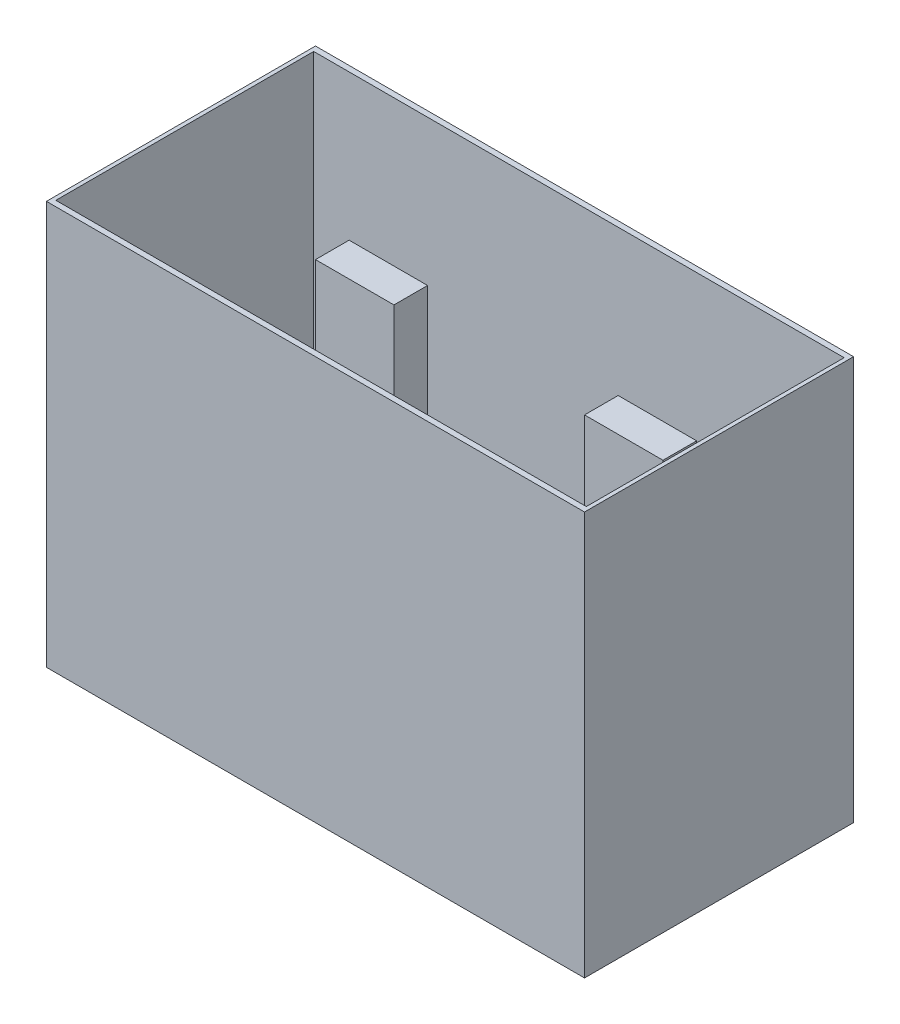
ISO-10303-21;
HEADER;
FILE_DESCRIPTION(('STEP AP214'),'2;1');
FILE_NAME('part.step','',(''),(''),'','','');
FILE_SCHEMA(('AUTOMOTIVE_DESIGN { 1 0 10303 214 1 1 1 1 }'));
ENDSEC;
DATA;
#1=APPLICATION_CONTEXT('core data for automotive mechanical design processes');
#2=APPLICATION_PROTOCOL_DEFINITION('international standard','automotive_design',2000,#1);
#3=PRODUCT_CONTEXT('',#1,'mechanical');
#4=PRODUCT('Part','Part','',(#3));
#5=PRODUCT_RELATED_PRODUCT_CATEGORY('part','',(#4));
#6=PRODUCT_DEFINITION_FORMATION('','',#4);
#7=PRODUCT_DEFINITION_CONTEXT('part definition',#1,'design');
#8=PRODUCT_DEFINITION('design','',#6,#7);
#9=PRODUCT_DEFINITION_SHAPE('','',#8);
#10=(LENGTH_UNIT() NAMED_UNIT(*) SI_UNIT(.MILLI.,.METRE.));
#11=(NAMED_UNIT(*) PLANE_ANGLE_UNIT() SI_UNIT($,.RADIAN.));
#12=(NAMED_UNIT(*) SI_UNIT($,.STERADIAN.) SOLID_ANGLE_UNIT());
#13=UNCERTAINTY_MEASURE_WITH_UNIT(LENGTH_MEASURE(1.E-05),#10,'distance_accuracy_value','');
#14=(GEOMETRIC_REPRESENTATION_CONTEXT(3) GLOBAL_UNCERTAINTY_ASSIGNED_CONTEXT((#13)) GLOBAL_UNIT_ASSIGNED_CONTEXT((#10,
#11,#12)) REPRESENTATION_CONTEXT('',''));
#15=CARTESIAN_POINT('',(0.,0.,0.));
#16=DIRECTION('',(0.,0.,1.));
#17=DIRECTION('',(1.,0.,0.));
#18=AXIS2_PLACEMENT_3D('',#15,#16,#17);
#19=CARTESIAN_POINT('',(0.,457.2,0.));
#20=DIRECTION('',(0.,-1.,0.));
#21=DIRECTION('',(0.,0.,-1.));
#22=AXIS2_PLACEMENT_3D('',#19,#20,#21);
#23=PLANE('',#22);
#24=DIRECTION('',(0.,0.,-1.));
#25=VECTOR('',#24,1.);
#26=CARTESIAN_POINT('',(304.8,457.2,152.4));
#27=LINE('',#26,#25);
#28=CARTESIAN_POINT('',(304.8,457.2,152.4));
#29=VERTEX_POINT('',#28);
#30=CARTESIAN_POINT('',(304.8,457.2,-152.4));
#31=VERTEX_POINT('',#30);
#32=EDGE_CURVE('E156',#29,#31,#27,.T.);
#33=ORIENTED_EDGE('',*,*,#32,.T.);
#34=DIRECTION('',(-1.,0.,0.));
#35=VECTOR('',#34,1.);
#36=CARTESIAN_POINT('',(-304.8,457.2,-152.4));
#37=LINE('',#36,#35);
#38=CARTESIAN_POINT('',(-304.8,457.2,-152.4));
#39=VERTEX_POINT('',#38);
#40=EDGE_CURVE('E159',#31,#39,#37,.T.);
#41=ORIENTED_EDGE('',*,*,#40,.T.);
#42=DIRECTION('',(0.,0.,1.));
#43=VECTOR('',#42,1.);
#44=CARTESIAN_POINT('',(-304.8,457.2,152.4));
#45=LINE('',#44,#43);
#46=CARTESIAN_POINT('',(-304.8,457.2,152.4));
#47=VERTEX_POINT('',#46);
#48=EDGE_CURVE('E162',#39,#47,#45,.T.);
#49=ORIENTED_EDGE('',*,*,#48,.T.);
#50=DIRECTION('',(1.,0.,0.));
#51=VECTOR('',#50,1.);
#52=CARTESIAN_POINT('',(-304.8,457.2,152.4));
#53=LINE('',#52,#51);
#54=EDGE_CURVE('E164',#47,#29,#53,.T.);
#55=ORIENTED_EDGE('',*,*,#54,.T.);
#56=EDGE_LOOP('',(#33,#41,#49,#55));
#57=FACE_BOUND('',#56,.T.);
#58=DIRECTION('',(0.,0.,-1.));
#59=VECTOR('',#58,1.);
#60=CARTESIAN_POINT('',(300.482,457.2,146.05));
#61=LINE('',#60,#59);
#62=CARTESIAN_POINT('',(300.482,457.2,146.05));
#63=VERTEX_POINT('',#62);
#64=CARTESIAN_POINT('',(300.482,457.2,-146.05));
#65=VERTEX_POINT('',#64);
#66=EDGE_CURVE('E120',#63,#65,#61,.T.);
#67=ORIENTED_EDGE('',*,*,#66,.F.);
#68=DIRECTION('',(1.,0.,0.));
#69=VECTOR('',#68,1.);
#70=CARTESIAN_POINT('',(-300.482,457.2,146.05));
#71=LINE('',#70,#69);
#72=CARTESIAN_POINT('',(-300.482,457.2,146.05));
#73=VERTEX_POINT('',#72);
#74=EDGE_CURVE('E142',#73,#63,#71,.T.);
#75=ORIENTED_EDGE('',*,*,#74,.F.);
#76=DIRECTION('',(0.,0.,1.));
#77=VECTOR('',#76,1.);
#78=CARTESIAN_POINT('',(-300.482,457.2,146.05));
#79=LINE('',#78,#77);
#80=CARTESIAN_POINT('',(-300.482,457.2,-146.05));
#81=VERTEX_POINT('',#80);
#82=EDGE_CURVE('E140',#81,#73,#79,.T.);
#83=ORIENTED_EDGE('',*,*,#82,.F.);
#84=DIRECTION('',(-1.,0.,0.));
#85=VECTOR('',#84,1.);
#86=CARTESIAN_POINT('',(-300.482,457.2,-146.05));
#87=LINE('',#86,#85);
#88=EDGE_CURVE('E128',#65,#81,#87,.T.);
#89=ORIENTED_EDGE('',*,*,#88,.F.);
#90=EDGE_LOOP('',(#67,#75,#83,#89));
#91=FACE_BOUND('',#90,.T.);
#92=ADVANCED_FACE('F55',(#57,#91),#23,.F.);
#93=CARTESIAN_POINT('',(0.,0.,0.));
#94=DIRECTION('',(0.,-1.,0.));
#95=DIRECTION('',(0.,0.,-1.));
#96=AXIS2_PLACEMENT_3D('',#93,#94,#95);
#97=PLANE('',#96);
#98=DIRECTION('',(0.,0.,-1.));
#99=VECTOR('',#98,1.);
#100=CARTESIAN_POINT('',(304.8,0.,152.4));
#101=LINE('',#100,#99);
#102=CARTESIAN_POINT('',(304.8,0.,152.4));
#103=VERTEX_POINT('',#102);
#104=CARTESIAN_POINT('',(304.8,0.,-152.4));
#105=VERTEX_POINT('',#104);
#106=EDGE_CURVE('E136',#103,#105,#101,.T.);
#107=ORIENTED_EDGE('',*,*,#106,.F.);
#108=DIRECTION('',(1.,0.,0.));
#109=VECTOR('',#108,1.);
#110=CARTESIAN_POINT('',(-304.8,0.,152.4));
#111=LINE('',#110,#109);
#112=CARTESIAN_POINT('',(-304.8,0.,152.4));
#113=VERTEX_POINT('',#112);
#114=EDGE_CURVE('E160',#113,#103,#111,.T.);
#115=ORIENTED_EDGE('',*,*,#114,.F.);
#116=DIRECTION('',(0.,0.,1.));
#117=VECTOR('',#116,1.);
#118=CARTESIAN_POINT('',(-304.8,0.,152.4));
#119=LINE('',#118,#117);
#120=CARTESIAN_POINT('',(-304.8,0.,-152.4));
#121=VERTEX_POINT('',#120);
#122=EDGE_CURVE('E171',#121,#113,#119,.T.);
#123=ORIENTED_EDGE('',*,*,#122,.F.);
#124=DIRECTION('',(-1.,0.,0.));
#125=VECTOR('',#124,1.);
#126=CARTESIAN_POINT('',(-304.8,0.,-152.4));
#127=LINE('',#126,#125);
#128=EDGE_CURVE('E169',#105,#121,#127,.T.);
#129=ORIENTED_EDGE('',*,*,#128,.F.);
#130=EDGE_LOOP('',(#107,#115,#123,#129));
#131=FACE_BOUND('',#130,.T.);
#132=DIRECTION('',(1.,0.,0.));
#133=VECTOR('',#132,1.);
#134=CARTESIAN_POINT('',(-300.482,0.,146.05));
#135=LINE('',#134,#133);
#136=CARTESIAN_POINT('',(-300.482,0.,146.05));
#137=VERTEX_POINT('',#136);
#138=CARTESIAN_POINT('',(300.482,0.,146.05));
#139=VERTEX_POINT('',#138);
#140=EDGE_CURVE('E129',#137,#139,#135,.T.);
#141=ORIENTED_EDGE('',*,*,#140,.T.);
#142=DIRECTION('',(0.,0.,-1.));
#143=VECTOR('',#142,1.);
#144=CARTESIAN_POINT('',(300.482,0.,146.05));
#145=LINE('',#144,#143);
#146=CARTESIAN_POINT('',(300.482,0.,-146.05));
#147=VERTEX_POINT('',#146);
#148=EDGE_CURVE('E78',#139,#147,#145,.T.);
#149=ORIENTED_EDGE('',*,*,#148,.T.);
#150=DIRECTION('',(-1.,0.,0.));
#151=VECTOR('',#150,1.);
#152=CARTESIAN_POINT('',(-300.482,0.,-146.05));
#153=LINE('',#152,#151);
#154=CARTESIAN_POINT('',(-300.482,0.,-146.05));
#155=VERTEX_POINT('',#154);
#156=EDGE_CURVE('E135',#147,#155,#153,.T.);
#157=ORIENTED_EDGE('',*,*,#156,.T.);
#158=DIRECTION('',(0.,0.,1.));
#159=VECTOR('',#158,1.);
#160=CARTESIAN_POINT('',(-300.482,0.,146.05));
#161=LINE('',#160,#159);
#162=EDGE_CURVE('E148',#155,#137,#161,.T.);
#163=ORIENTED_EDGE('',*,*,#162,.T.);
#164=EDGE_LOOP('',(#141,#149,#157,#163));
#165=FACE_BOUND('',#164,.T.);
#166=ADVANCED_FACE('F189',(#131,#165),#97,.T.);
#167=CARTESIAN_POINT('',(304.8,457.2,152.4));
#168=DIRECTION('',(-1.,0.,0.));
#169=DIRECTION('',(0.,0.,1.));
#170=AXIS2_PLACEMENT_3D('',#167,#168,#169);
#171=PLANE('',#170);
#172=ORIENTED_EDGE('',*,*,#106,.T.);
#173=DIRECTION('',(0.,-1.,0.));
#174=VECTOR('',#173,1.);
#175=CARTESIAN_POINT('',(304.8,457.2,-152.4));
#176=LINE('',#175,#174);
#177=EDGE_CURVE('E12',#31,#105,#176,.T.);
#178=ORIENTED_EDGE('',*,*,#177,.F.);
#179=ORIENTED_EDGE('',*,*,#32,.F.);
#180=DIRECTION('',(0.,-1.,0.));
#181=VECTOR('',#180,1.);
#182=CARTESIAN_POINT('',(304.8,457.2,152.4));
#183=LINE('',#182,#181);
#184=EDGE_CURVE('E166',#29,#103,#183,.T.);
#185=ORIENTED_EDGE('',*,*,#184,.T.);
#186=EDGE_LOOP('',(#172,#178,#179,#185));
#187=FACE_BOUND('',#186,.T.);
#188=ADVANCED_FACE('F57',(#187),#171,.F.);
#189=CARTESIAN_POINT('',(-304.8,457.2,-152.4));
#190=DIRECTION('',(0.,0.,1.));
#191=DIRECTION('',(1.,0.,0.));
#192=AXIS2_PLACEMENT_3D('',#189,#190,#191);
#193=PLANE('',#192);
#194=ORIENTED_EDGE('',*,*,#128,.T.);
#195=DIRECTION('',(0.,-1.,0.));
#196=VECTOR('',#195,1.);
#197=CARTESIAN_POINT('',(-304.8,457.2,-152.4));
#198=LINE('',#197,#196);
#199=EDGE_CURVE('E63',#39,#121,#198,.T.);
#200=ORIENTED_EDGE('',*,*,#199,.F.);
#201=ORIENTED_EDGE('',*,*,#40,.F.);
#202=ORIENTED_EDGE('',*,*,#177,.T.);
#203=EDGE_LOOP('',(#194,#200,#201,#202));
#204=FACE_BOUND('',#203,.T.);
#205=ADVANCED_FACE('F199',(#204),#193,.F.);
#206=CARTESIAN_POINT('',(-304.8,457.2,152.4));
#207=DIRECTION('',(1.,0.,0.));
#208=DIRECTION('',(0.,0.,-1.));
#209=AXIS2_PLACEMENT_3D('',#206,#207,#208);
#210=PLANE('',#209);
#211=ORIENTED_EDGE('',*,*,#122,.T.);
#212=DIRECTION('',(0.,-1.,0.));
#213=VECTOR('',#212,1.);
#214=CARTESIAN_POINT('',(-304.8,457.2,152.4));
#215=LINE('',#214,#213);
#216=EDGE_CURVE('E176',#47,#113,#215,.T.);
#217=ORIENTED_EDGE('',*,*,#216,.F.);
#218=ORIENTED_EDGE('',*,*,#48,.F.);
#219=ORIENTED_EDGE('',*,*,#199,.T.);
#220=EDGE_LOOP('',(#211,#217,#218,#219));
#221=FACE_BOUND('',#220,.T.);
#222=ADVANCED_FACE('F183',(#221),#210,.F.);
#223=CARTESIAN_POINT('',(-304.8,457.2,152.4));
#224=DIRECTION('',(0.,0.,-1.));
#225=DIRECTION('',(-1.,0.,0.));
#226=AXIS2_PLACEMENT_3D('',#223,#224,#225);
#227=PLANE('',#226);
#228=ORIENTED_EDGE('',*,*,#114,.T.);
#229=ORIENTED_EDGE('',*,*,#184,.F.);
#230=ORIENTED_EDGE('',*,*,#54,.F.);
#231=ORIENTED_EDGE('',*,*,#216,.T.);
#232=EDGE_LOOP('',(#228,#229,#230,#231));
#233=FACE_BOUND('',#232,.T.);
#234=ADVANCED_FACE('F193',(#233),#227,.F.);
#235=CARTESIAN_POINT('',(300.482,457.2,146.05));
#236=DIRECTION('',(-1.,0.,0.));
#237=DIRECTION('',(0.,0.,1.));
#238=AXIS2_PLACEMENT_3D('',#235,#236,#237);
#239=PLANE('',#238);
#240=ORIENTED_EDGE('',*,*,#148,.F.);
#241=DIRECTION('',(0.,-1.,0.));
#242=VECTOR('',#241,1.);
#243=CARTESIAN_POINT('',(300.482,457.2,146.05));
#244=LINE('',#243,#242);
#245=EDGE_CURVE('E124',#63,#139,#244,.T.);
#246=ORIENTED_EDGE('',*,*,#245,.F.);
#247=ORIENTED_EDGE('',*,*,#66,.T.);
#248=DIRECTION('',(0.,-1.,0.));
#249=VECTOR('',#248,1.);
#250=CARTESIAN_POINT('',(300.482,457.2,-146.05));
#251=LINE('',#250,#249);
#252=EDGE_CURVE('E123',#65,#147,#251,.T.);
#253=ORIENTED_EDGE('',*,*,#252,.T.);
#254=EDGE_LOOP('',(#240,#246,#247,#253));
#255=FACE_BOUND('',#254,.T.);
#256=ADVANCED_FACE('F122',(#255),#239,.T.);
#257=CARTESIAN_POINT('',(-300.482,457.2,-146.05));
#258=DIRECTION('',(0.,0.,1.));
#259=DIRECTION('',(1.,0.,0.));
#260=AXIS2_PLACEMENT_3D('',#257,#258,#259);
#261=PLANE('',#260);
#262=ORIENTED_EDGE('',*,*,#156,.F.);
#263=ORIENTED_EDGE('',*,*,#252,.F.);
#264=ORIENTED_EDGE('',*,*,#88,.T.);
#265=DIRECTION('',(0.,-1.,0.));
#266=VECTOR('',#265,1.);
#267=CARTESIAN_POINT('',(-300.482,457.2,-146.05));
#268=LINE('',#267,#266);
#269=EDGE_CURVE('E137',#81,#155,#268,.T.);
#270=ORIENTED_EDGE('',*,*,#269,.T.);
#271=EDGE_LOOP('',(#262,#263,#264,#270));
#272=FACE_BOUND('',#271,.T.);
#273=ADVANCED_FACE('F132',(#272),#261,.T.);
#274=CARTESIAN_POINT('',(-300.482,457.2,146.05));
#275=DIRECTION('',(1.,0.,0.));
#276=DIRECTION('',(0.,0.,-1.));
#277=AXIS2_PLACEMENT_3D('',#274,#275,#276);
#278=PLANE('',#277);
#279=ORIENTED_EDGE('',*,*,#162,.F.);
#280=ORIENTED_EDGE('',*,*,#269,.F.);
#281=ORIENTED_EDGE('',*,*,#82,.T.);
#282=DIRECTION('',(0.,-1.,0.));
#283=VECTOR('',#282,1.);
#284=CARTESIAN_POINT('',(-300.482,457.2,146.05));
#285=LINE('',#284,#283);
#286=EDGE_CURVE('E70',#73,#137,#285,.T.);
#287=ORIENTED_EDGE('',*,*,#286,.T.);
#288=EDGE_LOOP('',(#279,#280,#281,#287));
#289=FACE_BOUND('',#288,.T.);
#290=ADVANCED_FACE('F222',(#289),#278,.T.);
#291=CARTESIAN_POINT('',(-300.482,457.2,146.05));
#292=DIRECTION('',(0.,0.,-1.));
#293=DIRECTION('',(-1.,0.,0.));
#294=AXIS2_PLACEMENT_3D('',#291,#292,#293);
#295=PLANE('',#294);
#296=ORIENTED_EDGE('',*,*,#140,.F.);
#297=ORIENTED_EDGE('',*,*,#286,.F.);
#298=ORIENTED_EDGE('',*,*,#74,.T.);
#299=ORIENTED_EDGE('',*,*,#245,.T.);
#300=EDGE_LOOP('',(#296,#297,#298,#299));
#301=FACE_BOUND('',#300,.T.);
#302=ADVANCED_FACE('F226',(#301),#295,.T.);
#303=CLOSED_SHELL('',(#92,#166,#188,#205,#222,#234,#256,#273,#290,#302));
#304=MANIFOLD_SOLID_BREP('B2_NOT_SHOWN',#303);
#305=CARTESIAN_POINT('',(-292.1,6.35,-139.7));
#306=DIRECTION('',(1.,0.,0.));
#307=DIRECTION('',(0.,0.,-1.));
#308=AXIS2_PLACEMENT_3D('',#305,#306,#307);
#309=PLANE('',#308);
#310=DIRECTION('',(0.,0.,1.));
#311=VECTOR('',#310,1.);
#312=CARTESIAN_POINT('',(-292.1,0.,-139.7));
#313=LINE('',#312,#311);
#314=CARTESIAN_POINT('',(-292.1,0.,-139.7));
#315=VERTEX_POINT('',#314);
#316=CARTESIAN_POINT('',(-292.1,0.,139.7));
#317=VERTEX_POINT('',#316);
#318=EDGE_CURVE('E543',#315,#317,#313,.T.);
#319=ORIENTED_EDGE('',*,*,#318,.T.);
#320=DIRECTION('',(0.,-1.,0.));
#321=VECTOR('',#320,1.);
#322=CARTESIAN_POINT('',(-292.1,6.35,139.7));
#323=LINE('',#322,#321);
#324=CARTESIAN_POINT('',(-292.1,6.35,139.7));
#325=VERTEX_POINT('',#324);
#326=EDGE_CURVE('E53',#325,#317,#323,.T.);
#327=ORIENTED_EDGE('',*,*,#326,.F.);
#328=DIRECTION('',(0.,0.,1.));
#329=VECTOR('',#328,1.);
#330=CARTESIAN_POINT('',(-292.1,6.35,-139.7));
#331=LINE('',#330,#329);
#332=CARTESIAN_POINT('',(-292.1,6.35,-139.7));
#333=VERTEX_POINT('',#332);
#334=EDGE_CURVE('E549',#333,#325,#331,.T.);
#335=ORIENTED_EDGE('',*,*,#334,.F.);
#336=DIRECTION('',(0.,-1.,0.));
#337=VECTOR('',#336,1.);
#338=CARTESIAN_POINT('',(-292.1,6.35,-139.7));
#339=LINE('',#338,#337);
#340=EDGE_CURVE('E559',#333,#315,#339,.T.);
#341=ORIENTED_EDGE('',*,*,#340,.T.);
#342=EDGE_LOOP('',(#319,#327,#335,#341));
#343=FACE_BOUND('',#342,.T.);
#344=ADVANCED_FACE('F285',(#343),#309,.F.);
#345=CARTESIAN_POINT('',(-292.1,6.35,139.7));
#346=DIRECTION('',(0.,0.,-1.));
#347=DIRECTION('',(-1.,0.,0.));
#348=AXIS2_PLACEMENT_3D('',#345,#346,#347);
#349=PLANE('',#348);
#350=DIRECTION('',(1.,0.,0.));
#351=VECTOR('',#350,1.);
#352=CARTESIAN_POINT('',(-292.1,0.,139.7));
#353=LINE('',#352,#351);
#354=CARTESIAN_POINT('',(292.1,0.,139.7));
#355=VERTEX_POINT('',#354);
#356=EDGE_CURVE('E562',#317,#355,#353,.T.);
#357=ORIENTED_EDGE('',*,*,#356,.T.);
#358=DIRECTION('',(0.,-1.,0.));
#359=VECTOR('',#358,1.);
#360=CARTESIAN_POINT('',(292.1,6.35,139.7));
#361=LINE('',#360,#359);
#362=CARTESIAN_POINT('',(292.1,6.35,139.7));
#363=VERTEX_POINT('',#362);
#364=EDGE_CURVE('E292',#363,#355,#361,.T.);
#365=ORIENTED_EDGE('',*,*,#364,.F.);
#366=DIRECTION('',(1.,0.,0.));
#367=VECTOR('',#366,1.);
#368=CARTESIAN_POINT('',(-292.1,6.35,139.7));
#369=LINE('',#368,#367);
#370=EDGE_CURVE('E552',#325,#363,#369,.T.);
#371=ORIENTED_EDGE('',*,*,#370,.F.);
#372=ORIENTED_EDGE('',*,*,#326,.T.);
#373=EDGE_LOOP('',(#357,#365,#371,#372));
#374=FACE_BOUND('',#373,.T.);
#375=ADVANCED_FACE('F592',(#374),#349,.F.);
#376=CARTESIAN_POINT('',(292.1,6.35,-139.7));
#377=DIRECTION('',(-1.,0.,0.));
#378=DIRECTION('',(0.,0.,1.));
#379=AXIS2_PLACEMENT_3D('',#376,#377,#378);
#380=PLANE('',#379);
#381=DIRECTION('',(0.,0.,-1.));
#382=VECTOR('',#381,1.);
#383=CARTESIAN_POINT('',(292.1,0.,-139.7));
#384=LINE('',#383,#382);
#385=CARTESIAN_POINT('',(292.1,0.,-139.7));
#386=VERTEX_POINT('',#385);
#387=EDGE_CURVE('E564',#355,#386,#384,.T.);
#388=ORIENTED_EDGE('',*,*,#387,.T.);
#389=DIRECTION('',(0.,-1.,0.));
#390=VECTOR('',#389,1.);
#391=CARTESIAN_POINT('',(292.1,6.35,-139.7));
#392=LINE('',#391,#390);
#393=CARTESIAN_POINT('',(292.1,6.35,-139.7));
#394=VERTEX_POINT('',#393);
#395=EDGE_CURVE('E569',#394,#386,#392,.T.);
#396=ORIENTED_EDGE('',*,*,#395,.F.);
#397=DIRECTION('',(0.,0.,-1.));
#398=VECTOR('',#397,1.);
#399=CARTESIAN_POINT('',(292.1,6.35,-139.7));
#400=LINE('',#399,#398);
#401=EDGE_CURVE('E555',#363,#394,#400,.T.);
#402=ORIENTED_EDGE('',*,*,#401,.F.);
#403=ORIENTED_EDGE('',*,*,#364,.T.);
#404=EDGE_LOOP('',(#388,#396,#402,#403));
#405=FACE_BOUND('',#404,.T.);
#406=ADVANCED_FACE('F576',(#405),#380,.F.);
#407=CARTESIAN_POINT('',(-292.1,6.35,-139.7));
#408=DIRECTION('',(0.,0.,1.));
#409=DIRECTION('',(1.,0.,0.));
#410=AXIS2_PLACEMENT_3D('',#407,#408,#409);
#411=PLANE('',#410);
#412=DIRECTION('',(-1.,0.,0.));
#413=VECTOR('',#412,1.);
#414=CARTESIAN_POINT('',(-292.1,0.,-139.7));
#415=LINE('',#414,#413);
#416=EDGE_CURVE('E553',#386,#315,#415,.T.);
#417=ORIENTED_EDGE('',*,*,#416,.T.);
#418=ORIENTED_EDGE('',*,*,#340,.F.);
#419=DIRECTION('',(-1.,0.,0.));
#420=VECTOR('',#419,1.);
#421=CARTESIAN_POINT('',(-292.1,6.35,-139.7));
#422=LINE('',#421,#420);
#423=EDGE_CURVE('E557',#394,#333,#422,.T.);
#424=ORIENTED_EDGE('',*,*,#423,.F.);
#425=ORIENTED_EDGE('',*,*,#395,.T.);
#426=EDGE_LOOP('',(#417,#418,#424,#425));
#427=FACE_BOUND('',#426,.T.);
#428=ADVANCED_FACE('F585',(#427),#411,.F.);
#429=CARTESIAN_POINT('',(0.,6.35,0.));
#430=DIRECTION('',(0.,1.,0.));
#431=DIRECTION('',(0.,0.,1.));
#432=AXIS2_PLACEMENT_3D('',#429,#430,#431);
#433=PLANE('',#432);
#434=DIRECTION('',(1.,0.,0.));
#435=VECTOR('',#434,1.);
#436=CARTESIAN_POINT('',(63.5000000000001,6.35,-127.));
#437=LINE('',#436,#435);
#438=CARTESIAN_POINT('',(63.5000000000001,6.35,-127.));
#439=VERTEX_POINT('',#438);
#440=CARTESIAN_POINT('',(152.4,6.35,-127.));
#441=VERTEX_POINT('',#440);
#442=EDGE_CURVE('E453',#439,#441,#437,.T.);
#443=ORIENTED_EDGE('',*,*,#442,.T.);
#444=DIRECTION('',(0.,0.,-1.));
#445=VECTOR('',#444,1.);
#446=CARTESIAN_POINT('',(152.4,6.35,-88.9));
#447=LINE('',#446,#445);
#448=CARTESIAN_POINT('',(152.4,6.35,-88.9));
#449=VERTEX_POINT('',#448);
#450=EDGE_CURVE('E437',#449,#441,#447,.T.);
#451=ORIENTED_EDGE('',*,*,#450,.F.);
#452=DIRECTION('',(1.,0.,0.));
#453=VECTOR('',#452,1.);
#454=CARTESIAN_POINT('',(63.5000000000001,6.35,-88.9));
#455=LINE('',#454,#453);
#456=CARTESIAN_POINT('',(63.5000000000001,6.35,-88.9));
#457=VERTEX_POINT('',#456);
#458=EDGE_CURVE('E448',#457,#449,#455,.T.);
#459=ORIENTED_EDGE('',*,*,#458,.F.);
#460=DIRECTION('',(0.,0.,-1.));
#461=VECTOR('',#460,1.);
#462=CARTESIAN_POINT('',(63.5000000000001,6.35,-88.9));
#463=LINE('',#462,#461);
#464=EDGE_CURVE('E445',#457,#439,#463,.T.);
#465=ORIENTED_EDGE('',*,*,#464,.T.);
#466=EDGE_LOOP('',(#443,#451,#459,#465));
#467=FACE_BOUND('',#466,.T.);
#468=DIRECTION('',(1.,0.,0.));
#469=VECTOR('',#468,1.);
#470=CARTESIAN_POINT('',(-241.3,6.35,-127.));
#471=LINE('',#470,#469);
#472=CARTESIAN_POINT('',(-241.3,6.35,-127.));
#473=VERTEX_POINT('',#472);
#474=CARTESIAN_POINT('',(-152.4,6.35,-127.));
#475=VERTEX_POINT('',#474);
#476=EDGE_CURVE('E458',#473,#475,#471,.T.);
#477=ORIENTED_EDGE('',*,*,#476,.T.);
#478=DIRECTION('',(0.,0.,-1.));
#479=VECTOR('',#478,1.);
#480=CARTESIAN_POINT('',(-152.4,6.35,-88.9));
#481=LINE('',#480,#479);
#482=CARTESIAN_POINT('',(-152.4,6.35,-88.9));
#483=VERTEX_POINT('',#482);
#484=EDGE_CURVE('E476',#483,#475,#481,.T.);
#485=ORIENTED_EDGE('',*,*,#484,.F.);
#486=DIRECTION('',(1.,0.,0.));
#487=VECTOR('',#486,1.);
#488=CARTESIAN_POINT('',(-241.3,6.35,-88.9));
#489=LINE('',#488,#487);
#490=CARTESIAN_POINT('',(-241.3,6.35,-88.9));
#491=VERTEX_POINT('',#490);
#492=EDGE_CURVE('E478',#491,#483,#489,.T.);
#493=ORIENTED_EDGE('',*,*,#492,.F.);
#494=DIRECTION('',(0.,0.,-1.));
#495=VECTOR('',#494,1.);
#496=CARTESIAN_POINT('',(-241.3,6.35,-88.9));
#497=LINE('',#496,#495);
#498=EDGE_CURVE('E466',#491,#473,#497,.T.);
#499=ORIENTED_EDGE('',*,*,#498,.T.);
#500=EDGE_LOOP('',(#477,#485,#493,#499));
#501=FACE_BOUND('',#500,.T.);
#502=DIRECTION('',(1.,0.,0.));
#503=VECTOR('',#502,1.);
#504=CARTESIAN_POINT('',(63.5000000000001,6.35,88.9));
#505=LINE('',#504,#503);
#506=CARTESIAN_POINT('',(63.5000000000001,6.35,88.9));
#507=VERTEX_POINT('',#506);
#508=CARTESIAN_POINT('',(152.4,6.35,88.9));
#509=VERTEX_POINT('',#508);
#510=EDGE_CURVE('E484',#507,#509,#505,.T.);
#511=ORIENTED_EDGE('',*,*,#510,.T.);
#512=DIRECTION('',(0.,0.,-1.));
#513=VECTOR('',#512,1.);
#514=CARTESIAN_POINT('',(152.4,6.35,127.));
#515=LINE('',#514,#513);
#516=CARTESIAN_POINT('',(152.4,6.35,127.));
#517=VERTEX_POINT('',#516);
#518=EDGE_CURVE('E503',#517,#509,#515,.T.);
#519=ORIENTED_EDGE('',*,*,#518,.F.);
#520=DIRECTION('',(1.,0.,0.));
#521=VECTOR('',#520,1.);
#522=CARTESIAN_POINT('',(63.5000000000001,6.35,127.));
#523=LINE('',#522,#521);
#524=CARTESIAN_POINT('',(63.5000000000001,6.35,127.));
#525=VERTEX_POINT('',#524);
#526=EDGE_CURVE('E506',#525,#517,#523,.T.);
#527=ORIENTED_EDGE('',*,*,#526,.F.);
#528=DIRECTION('',(0.,0.,-1.));
#529=VECTOR('',#528,1.);
#530=CARTESIAN_POINT('',(63.5000000000001,6.35,127.));
#531=LINE('',#530,#529);
#532=EDGE_CURVE('E493',#525,#507,#531,.T.);
#533=ORIENTED_EDGE('',*,*,#532,.T.);
#534=EDGE_LOOP('',(#511,#519,#527,#533));
#535=FACE_BOUND('',#534,.T.);
#536=DIRECTION('',(1.,0.,0.));
#537=VECTOR('',#536,1.);
#538=CARTESIAN_POINT('',(-241.3,6.35,88.9));
#539=LINE('',#538,#537);
#540=CARTESIAN_POINT('',(-241.3,6.35,88.9));
#541=VERTEX_POINT('',#540);
#542=CARTESIAN_POINT('',(-152.4,6.35,88.9));
#543=VERTEX_POINT('',#542);
#544=EDGE_CURVE('E513',#541,#543,#539,.T.);
#545=ORIENTED_EDGE('',*,*,#544,.T.);
#546=DIRECTION('',(0.,0.,-1.));
#547=VECTOR('',#546,1.);
#548=CARTESIAN_POINT('',(-152.4,6.35,127.));
#549=LINE('',#548,#547);
#550=CARTESIAN_POINT('',(-152.4,6.35,127.));
#551=VERTEX_POINT('',#550);
#552=EDGE_CURVE('E533',#551,#543,#549,.T.);
#553=ORIENTED_EDGE('',*,*,#552,.F.);
#554=DIRECTION('',(1.,0.,0.));
#555=VECTOR('',#554,1.);
#556=CARTESIAN_POINT('',(-241.3,6.35,127.));
#557=LINE('',#556,#555);
#558=CARTESIAN_POINT('',(-241.3,6.35,127.));
#559=VERTEX_POINT('',#558);
#560=EDGE_CURVE('E536',#559,#551,#557,.T.);
#561=ORIENTED_EDGE('',*,*,#560,.F.);
#562=DIRECTION('',(0.,0.,-1.));
#563=VECTOR('',#562,1.);
#564=CARTESIAN_POINT('',(-241.3,6.35,127.));
#565=LINE('',#564,#563);
#566=EDGE_CURVE('E523',#559,#541,#565,.T.);
#567=ORIENTED_EDGE('',*,*,#566,.T.);
#568=EDGE_LOOP('',(#545,#553,#561,#567));
#569=FACE_BOUND('',#568,.T.);
#570=ORIENTED_EDGE('',*,*,#334,.T.);
#571=ORIENTED_EDGE('',*,*,#370,.T.);
#572=ORIENTED_EDGE('',*,*,#401,.T.);
#573=ORIENTED_EDGE('',*,*,#423,.T.);
#574=EDGE_LOOP('',(#570,#571,#572,#573));
#575=FACE_BOUND('',#574,.T.);
#576=ADVANCED_FACE('F591',(#467,#501,#535,#569,#575),#433,.T.);
#577=CARTESIAN_POINT('',(0.,0.,0.));
#578=DIRECTION('',(0.,1.,0.));
#579=DIRECTION('',(0.,0.,1.));
#580=AXIS2_PLACEMENT_3D('',#577,#578,#579);
#581=PLANE('',#580);
#582=ORIENTED_EDGE('',*,*,#318,.F.);
#583=ORIENTED_EDGE('',*,*,#416,.F.);
#584=ORIENTED_EDGE('',*,*,#387,.F.);
#585=ORIENTED_EDGE('',*,*,#356,.F.);
#586=EDGE_LOOP('',(#582,#583,#584,#585));
#587=FACE_BOUND('',#586,.T.);
#588=ADVANCED_FACE('F582',(#587),#581,.F.);
#589=CARTESIAN_POINT('',(-241.3,311.15,88.9));
#590=DIRECTION('',(0.,0.,-1.));
#591=DIRECTION('',(-1.,0.,0.));
#592=AXIS2_PLACEMENT_3D('',#589,#590,#591);
#593=PLANE('',#592);
#594=ORIENTED_EDGE('',*,*,#544,.F.);
#595=DIRECTION('',(0.,-1.,0.));
#596=VECTOR('',#595,1.);
#597=CARTESIAN_POINT('',(-241.3,311.15,88.9));
#598=LINE('',#597,#596);
#599=CARTESIAN_POINT('',(-241.3,311.15,88.9));
#600=VERTEX_POINT('',#599);
#601=EDGE_CURVE('E541',#600,#541,#598,.T.);
#602=ORIENTED_EDGE('',*,*,#601,.F.);
#603=DIRECTION('',(1.,0.,0.));
#604=VECTOR('',#603,1.);
#605=CARTESIAN_POINT('',(-241.3,311.15,88.9));
#606=LINE('',#605,#604);
#607=CARTESIAN_POINT('',(-152.4,311.15,88.9));
#608=VERTEX_POINT('',#607);
#609=EDGE_CURVE('E519',#600,#608,#606,.T.);
#610=ORIENTED_EDGE('',*,*,#609,.T.);
#611=DIRECTION('',(0.,-1.,0.));
#612=VECTOR('',#611,1.);
#613=CARTESIAN_POINT('',(-152.4,311.15,88.9));
#614=LINE('',#613,#612);
#615=EDGE_CURVE('E530',#608,#543,#614,.T.);
#616=ORIENTED_EDGE('',*,*,#615,.T.);
#617=EDGE_LOOP('',(#594,#602,#610,#616));
#618=FACE_BOUND('',#617,.T.);
#619=ADVANCED_FACE('F604',(#618),#593,.T.);
#620=CARTESIAN_POINT('',(-241.3,311.15,127.));
#621=DIRECTION('',(-1.,0.,0.));
#622=DIRECTION('',(0.,0.,1.));
#623=AXIS2_PLACEMENT_3D('',#620,#621,#622);
#624=PLANE('',#623);
#625=ORIENTED_EDGE('',*,*,#566,.F.);
#626=DIRECTION('',(0.,-1.,0.));
#627=VECTOR('',#626,1.);
#628=CARTESIAN_POINT('',(-241.3,311.15,127.));
#629=LINE('',#628,#627);
#630=CARTESIAN_POINT('',(-241.3,311.15,127.));
#631=VERTEX_POINT('',#630);
#632=EDGE_CURVE('E544',#631,#559,#629,.T.);
#633=ORIENTED_EDGE('',*,*,#632,.F.);
#634=DIRECTION('',(0.,0.,-1.));
#635=VECTOR('',#634,1.);
#636=CARTESIAN_POINT('',(-241.3,311.15,127.));
#637=LINE('',#636,#635);
#638=EDGE_CURVE('E527',#631,#600,#637,.T.);
#639=ORIENTED_EDGE('',*,*,#638,.T.);
#640=ORIENTED_EDGE('',*,*,#601,.T.);
#641=EDGE_LOOP('',(#625,#633,#639,#640));
#642=FACE_BOUND('',#641,.T.);
#643=ADVANCED_FACE('F610',(#642),#624,.T.);
#644=CARTESIAN_POINT('',(-241.3,311.15,127.));
#645=DIRECTION('',(0.,0.,-1.));
#646=DIRECTION('',(-1.,0.,0.));
#647=AXIS2_PLACEMENT_3D('',#644,#645,#646);
#648=PLANE('',#647);
#649=ORIENTED_EDGE('',*,*,#560,.T.);
#650=DIRECTION('',(0.,-1.,0.));
#651=VECTOR('',#650,1.);
#652=CARTESIAN_POINT('',(-152.4,311.15,127.));
#653=LINE('',#652,#651);
#654=CARTESIAN_POINT('',(-152.4,311.15,127.));
#655=VERTEX_POINT('',#654);
#656=EDGE_CURVE('E546',#655,#551,#653,.T.);
#657=ORIENTED_EDGE('',*,*,#656,.F.);
#658=DIRECTION('',(1.,0.,0.));
#659=VECTOR('',#658,1.);
#660=CARTESIAN_POINT('',(-241.3,311.15,127.));
#661=LINE('',#660,#659);
#662=EDGE_CURVE('E525',#631,#655,#661,.T.);
#663=ORIENTED_EDGE('',*,*,#662,.F.);
#664=ORIENTED_EDGE('',*,*,#632,.T.);
#665=EDGE_LOOP('',(#649,#657,#663,#664));
#666=FACE_BOUND('',#665,.T.);
#667=ADVANCED_FACE('F616',(#666),#648,.F.);
#668=CARTESIAN_POINT('',(-152.4,311.15,127.));
#669=DIRECTION('',(-1.,0.,0.));
#670=DIRECTION('',(0.,0.,1.));
#671=AXIS2_PLACEMENT_3D('',#668,#669,#670);
#672=PLANE('',#671);
#673=ORIENTED_EDGE('',*,*,#552,.T.);
#674=ORIENTED_EDGE('',*,*,#615,.F.);
#675=DIRECTION('',(0.,0.,-1.));
#676=VECTOR('',#675,1.);
#677=CARTESIAN_POINT('',(-152.4,311.15,127.));
#678=LINE('',#677,#676);
#679=EDGE_CURVE('E522',#655,#608,#678,.T.);
#680=ORIENTED_EDGE('',*,*,#679,.F.);
#681=ORIENTED_EDGE('',*,*,#656,.T.);
#682=EDGE_LOOP('',(#673,#674,#680,#681));
#683=FACE_BOUND('',#682,.T.);
#684=ADVANCED_FACE('F612',(#683),#672,.F.);
#685=CARTESIAN_POINT('',(0.,311.15,0.));
#686=DIRECTION('',(0.,1.,0.));
#687=DIRECTION('',(0.,0.,1.));
#688=AXIS2_PLACEMENT_3D('',#685,#686,#687);
#689=PLANE('',#688);
#690=ORIENTED_EDGE('',*,*,#609,.F.);
#691=ORIENTED_EDGE('',*,*,#638,.F.);
#692=ORIENTED_EDGE('',*,*,#662,.T.);
#693=ORIENTED_EDGE('',*,*,#679,.T.);
#694=EDGE_LOOP('',(#690,#691,#692,#693));
#695=FACE_BOUND('',#694,.T.);
#696=ADVANCED_FACE('F615',(#695),#689,.T.);
#697=CARTESIAN_POINT('',(63.5000000000001,311.15,88.9));
#698=DIRECTION('',(0.,0.,-1.));
#699=DIRECTION('',(-1.,0.,0.));
#700=AXIS2_PLACEMENT_3D('',#697,#698,#699);
#701=PLANE('',#700);
#702=ORIENTED_EDGE('',*,*,#510,.F.);
#703=DIRECTION('',(0.,-1.,0.));
#704=VECTOR('',#703,1.);
#705=CARTESIAN_POINT('',(63.5000000000001,311.15,88.9));
#706=LINE('',#705,#704);
#707=CARTESIAN_POINT('',(63.5000000000001,311.15,88.9));
#708=VERTEX_POINT('',#707);
#709=EDGE_CURVE('E511',#708,#507,#706,.T.);
#710=ORIENTED_EDGE('',*,*,#709,.F.);
#711=DIRECTION('',(1.,0.,0.));
#712=VECTOR('',#711,1.);
#713=CARTESIAN_POINT('',(63.5000000000001,311.15,88.9));
#714=LINE('',#713,#712);
#715=CARTESIAN_POINT('',(152.4,311.15,88.9));
#716=VERTEX_POINT('',#715);
#717=EDGE_CURVE('E489',#708,#716,#714,.T.);
#718=ORIENTED_EDGE('',*,*,#717,.T.);
#719=DIRECTION('',(0.,-1.,0.));
#720=VECTOR('',#719,1.);
#721=CARTESIAN_POINT('',(152.4,311.15,88.9));
#722=LINE('',#721,#720);
#723=EDGE_CURVE('E500',#716,#509,#722,.T.);
#724=ORIENTED_EDGE('',*,*,#723,.T.);
#725=EDGE_LOOP('',(#702,#710,#718,#724));
#726=FACE_BOUND('',#725,.T.);
#727=ADVANCED_FACE('F626',(#726),#701,.T.);
#728=CARTESIAN_POINT('',(63.5000000000001,311.15,127.));
#729=DIRECTION('',(-1.,0.,0.));
#730=DIRECTION('',(0.,0.,1.));
#731=AXIS2_PLACEMENT_3D('',#728,#729,#730);
#732=PLANE('',#731);
#733=ORIENTED_EDGE('',*,*,#532,.F.);
#734=DIRECTION('',(0.,-1.,0.));
#735=VECTOR('',#734,1.);
#736=CARTESIAN_POINT('',(63.5000000000001,311.15,127.));
#737=LINE('',#736,#735);
#738=CARTESIAN_POINT('',(63.5000000000001,311.15,127.));
#739=VERTEX_POINT('',#738);
#740=EDGE_CURVE('E514',#739,#525,#737,.T.);
#741=ORIENTED_EDGE('',*,*,#740,.F.);
#742=DIRECTION('',(0.,0.,-1.));
#743=VECTOR('',#742,1.);
#744=CARTESIAN_POINT('',(63.5000000000001,311.15,127.));
#745=LINE('',#744,#743);
#746=EDGE_CURVE('E497',#739,#708,#745,.T.);
#747=ORIENTED_EDGE('',*,*,#746,.T.);
#748=ORIENTED_EDGE('',*,*,#709,.T.);
#749=EDGE_LOOP('',(#733,#741,#747,#748));
#750=FACE_BOUND('',#749,.T.);
#751=ADVANCED_FACE('F630',(#750),#732,.T.);
#752=CARTESIAN_POINT('',(63.5000000000001,311.15,127.));
#753=DIRECTION('',(0.,0.,-1.));
#754=DIRECTION('',(-1.,0.,0.));
#755=AXIS2_PLACEMENT_3D('',#752,#753,#754);
#756=PLANE('',#755);
#757=ORIENTED_EDGE('',*,*,#526,.T.);
#758=DIRECTION('',(0.,-1.,0.));
#759=VECTOR('',#758,1.);
#760=CARTESIAN_POINT('',(152.4,311.15,127.));
#761=LINE('',#760,#759);
#762=CARTESIAN_POINT('',(152.4,311.15,127.));
#763=VERTEX_POINT('',#762);
#764=EDGE_CURVE('E516',#763,#517,#761,.T.);
#765=ORIENTED_EDGE('',*,*,#764,.F.);
#766=DIRECTION('',(1.,0.,0.));
#767=VECTOR('',#766,1.);
#768=CARTESIAN_POINT('',(63.5000000000001,311.15,127.));
#769=LINE('',#768,#767);
#770=EDGE_CURVE('E495',#739,#763,#769,.T.);
#771=ORIENTED_EDGE('',*,*,#770,.F.);
#772=ORIENTED_EDGE('',*,*,#740,.T.);
#773=EDGE_LOOP('',(#757,#765,#771,#772));
#774=FACE_BOUND('',#773,.T.);
#775=ADVANCED_FACE('F636',(#774),#756,.F.);
#776=CARTESIAN_POINT('',(152.4,311.15,127.));
#777=DIRECTION('',(-1.,0.,0.));
#778=DIRECTION('',(0.,0.,1.));
#779=AXIS2_PLACEMENT_3D('',#776,#777,#778);
#780=PLANE('',#779);
#781=ORIENTED_EDGE('',*,*,#518,.T.);
#782=ORIENTED_EDGE('',*,*,#723,.F.);
#783=DIRECTION('',(0.,0.,-1.));
#784=VECTOR('',#783,1.);
#785=CARTESIAN_POINT('',(152.4,311.15,127.));
#786=LINE('',#785,#784);
#787=EDGE_CURVE('E492',#763,#716,#786,.T.);
#788=ORIENTED_EDGE('',*,*,#787,.F.);
#789=ORIENTED_EDGE('',*,*,#764,.T.);
#790=EDGE_LOOP('',(#781,#782,#788,#789));
#791=FACE_BOUND('',#790,.T.);
#792=ADVANCED_FACE('F632',(#791),#780,.F.);
#793=CARTESIAN_POINT('',(304.8,311.15,0.));
#794=DIRECTION('',(0.,1.,0.));
#795=DIRECTION('',(0.,0.,1.));
#796=AXIS2_PLACEMENT_3D('',#793,#794,#795);
#797=PLANE('',#796);
#798=ORIENTED_EDGE('',*,*,#717,.F.);
#799=ORIENTED_EDGE('',*,*,#746,.F.);
#800=ORIENTED_EDGE('',*,*,#770,.T.);
#801=ORIENTED_EDGE('',*,*,#787,.T.);
#802=EDGE_LOOP('',(#798,#799,#800,#801));
#803=FACE_BOUND('',#802,.T.);
#804=ADVANCED_FACE('F635',(#803),#797,.T.);
#805=CARTESIAN_POINT('',(-241.3,311.15,-127.));
#806=DIRECTION('',(0.,0.,-1.));
#807=DIRECTION('',(-1.,0.,0.));
#808=AXIS2_PLACEMENT_3D('',#805,#806,#807);
#809=PLANE('',#808);
#810=ORIENTED_EDGE('',*,*,#476,.F.);
#811=DIRECTION('',(0.,-1.,0.));
#812=VECTOR('',#811,1.);
#813=CARTESIAN_POINT('',(-241.3,311.15,-127.));
#814=LINE('',#813,#812);
#815=CARTESIAN_POINT('',(-241.3,311.15,-127.));
#816=VERTEX_POINT('',#815);
#817=EDGE_CURVE('E482',#816,#473,#814,.T.);
#818=ORIENTED_EDGE('',*,*,#817,.F.);
#819=DIRECTION('',(1.,0.,0.));
#820=VECTOR('',#819,1.);
#821=CARTESIAN_POINT('',(-241.3,311.15,-127.));
#822=LINE('',#821,#820);
#823=CARTESIAN_POINT('',(-152.4,311.15,-127.));
#824=VERTEX_POINT('',#823);
#825=EDGE_CURVE('E462',#816,#824,#822,.T.);
#826=ORIENTED_EDGE('',*,*,#825,.T.);
#827=DIRECTION('',(0.,-1.,0.));
#828=VECTOR('',#827,1.);
#829=CARTESIAN_POINT('',(-152.4,311.15,-127.));
#830=LINE('',#829,#828);
#831=EDGE_CURVE('E473',#824,#475,#830,.T.);
#832=ORIENTED_EDGE('',*,*,#831,.T.);
#833=EDGE_LOOP('',(#810,#818,#826,#832));
#834=FACE_BOUND('',#833,.T.);
#835=ADVANCED_FACE('F646',(#834),#809,.T.);
#836=CARTESIAN_POINT('',(-241.3,311.15,-88.9));
#837=DIRECTION('',(-1.,0.,0.));
#838=DIRECTION('',(0.,0.,1.));
#839=AXIS2_PLACEMENT_3D('',#836,#837,#838);
#840=PLANE('',#839);
#841=ORIENTED_EDGE('',*,*,#498,.F.);
#842=DIRECTION('',(0.,-1.,0.));
#843=VECTOR('',#842,1.);
#844=CARTESIAN_POINT('',(-241.3,311.15,-88.9));
#845=LINE('',#844,#843);
#846=CARTESIAN_POINT('',(-241.3,311.15,-88.9));
#847=VERTEX_POINT('',#846);
#848=EDGE_CURVE('E485',#847,#491,#845,.T.);
#849=ORIENTED_EDGE('',*,*,#848,.F.);
#850=DIRECTION('',(0.,0.,-1.));
#851=VECTOR('',#850,1.);
#852=CARTESIAN_POINT('',(-241.3,311.15,-88.9));
#853=LINE('',#852,#851);
#854=EDGE_CURVE('E470',#847,#816,#853,.T.);
#855=ORIENTED_EDGE('',*,*,#854,.T.);
#856=ORIENTED_EDGE('',*,*,#817,.T.);
#857=EDGE_LOOP('',(#841,#849,#855,#856));
#858=FACE_BOUND('',#857,.T.);
#859=ADVANCED_FACE('F650',(#858),#840,.T.);
#860=CARTESIAN_POINT('',(-241.3,311.15,-88.9));
#861=DIRECTION('',(0.,0.,-1.));
#862=DIRECTION('',(-1.,0.,0.));
#863=AXIS2_PLACEMENT_3D('',#860,#861,#862);
#864=PLANE('',#863);
#865=ORIENTED_EDGE('',*,*,#492,.T.);
#866=DIRECTION('',(0.,-1.,0.));
#867=VECTOR('',#866,1.);
#868=CARTESIAN_POINT('',(-152.4,311.15,-88.9));
#869=LINE('',#868,#867);
#870=CARTESIAN_POINT('',(-152.4,311.15,-88.9));
#871=VERTEX_POINT('',#870);
#872=EDGE_CURVE('E307',#871,#483,#869,.T.);
#873=ORIENTED_EDGE('',*,*,#872,.F.);
#874=DIRECTION('',(1.,0.,0.));
#875=VECTOR('',#874,1.);
#876=CARTESIAN_POINT('',(-241.3,311.15,-88.9));
#877=LINE('',#876,#875);
#878=EDGE_CURVE('E468',#847,#871,#877,.T.);
#879=ORIENTED_EDGE('',*,*,#878,.F.);
#880=ORIENTED_EDGE('',*,*,#848,.T.);
#881=EDGE_LOOP('',(#865,#873,#879,#880));
#882=FACE_BOUND('',#881,.T.);
#883=ADVANCED_FACE('F656',(#882),#864,.F.);
#884=CARTESIAN_POINT('',(-152.4,311.15,-88.9));
#885=DIRECTION('',(-1.,0.,0.));
#886=DIRECTION('',(0.,0.,1.));
#887=AXIS2_PLACEMENT_3D('',#884,#885,#886);
#888=PLANE('',#887);
#889=ORIENTED_EDGE('',*,*,#484,.T.);
#890=ORIENTED_EDGE('',*,*,#831,.F.);
#891=DIRECTION('',(0.,0.,-1.));
#892=VECTOR('',#891,1.);
#893=CARTESIAN_POINT('',(-152.4,311.15,-88.9));
#894=LINE('',#893,#892);
#895=EDGE_CURVE('E465',#871,#824,#894,.T.);
#896=ORIENTED_EDGE('',*,*,#895,.F.);
#897=ORIENTED_EDGE('',*,*,#872,.T.);
#898=EDGE_LOOP('',(#889,#890,#896,#897));
#899=FACE_BOUND('',#898,.T.);
#900=ADVANCED_FACE('F652',(#899),#888,.F.);
#901=CARTESIAN_POINT('',(0.,311.15,-215.9));
#902=DIRECTION('',(0.,1.,0.));
#903=DIRECTION('',(0.,0.,1.));
#904=AXIS2_PLACEMENT_3D('',#901,#902,#903);
#905=PLANE('',#904);
#906=ORIENTED_EDGE('',*,*,#825,.F.);
#907=ORIENTED_EDGE('',*,*,#854,.F.);
#908=ORIENTED_EDGE('',*,*,#878,.T.);
#909=ORIENTED_EDGE('',*,*,#895,.T.);
#910=EDGE_LOOP('',(#906,#907,#908,#909));
#911=FACE_BOUND('',#910,.T.);
#912=ADVANCED_FACE('F655',(#911),#905,.T.);
#913=CARTESIAN_POINT('',(63.5000000000001,311.15,-127.));
#914=DIRECTION('',(0.,0.,-1.));
#915=DIRECTION('',(-1.,0.,0.));
#916=AXIS2_PLACEMENT_3D('',#913,#914,#915);
#917=PLANE('',#916);
#918=ORIENTED_EDGE('',*,*,#442,.F.);
#919=DIRECTION('',(0.,-1.,0.));
#920=VECTOR('',#919,1.);
#921=CARTESIAN_POINT('',(63.5000000000001,311.15,-127.));
#922=LINE('',#921,#920);
#923=CARTESIAN_POINT('',(63.5000000000001,311.15,-127.));
#924=VERTEX_POINT('',#923);
#925=EDGE_CURVE('E444',#924,#439,#922,.T.);
#926=ORIENTED_EDGE('',*,*,#925,.F.);
#927=DIRECTION('',(1.,0.,0.));
#928=VECTOR('',#927,1.);
#929=CARTESIAN_POINT('',(63.5000000000001,311.15,-127.));
#930=LINE('',#929,#928);
#931=CARTESIAN_POINT('',(152.4,311.15,-127.));
#932=VERTEX_POINT('',#931);
#933=EDGE_CURVE('E429',#924,#932,#930,.T.);
#934=ORIENTED_EDGE('',*,*,#933,.T.);
#935=DIRECTION('',(0.,-1.,0.));
#936=VECTOR('',#935,1.);
#937=CARTESIAN_POINT('',(152.4,311.15,-127.));
#938=LINE('',#937,#936);
#939=EDGE_CURVE('E434',#932,#441,#938,.T.);
#940=ORIENTED_EDGE('',*,*,#939,.T.);
#941=EDGE_LOOP('',(#918,#926,#934,#940));
#942=FACE_BOUND('',#941,.T.);
#943=ADVANCED_FACE('F443',(#942),#917,.T.);
#944=CARTESIAN_POINT('',(63.5000000000001,311.15,-88.9));
#945=DIRECTION('',(-1.,0.,0.));
#946=DIRECTION('',(0.,0.,1.));
#947=AXIS2_PLACEMENT_3D('',#944,#945,#946);
#948=PLANE('',#947);
#949=ORIENTED_EDGE('',*,*,#464,.F.);
#950=DIRECTION('',(0.,-1.,0.));
#951=VECTOR('',#950,1.);
#952=CARTESIAN_POINT('',(63.5000000000001,311.15,-88.9));
#953=LINE('',#952,#951);
#954=CARTESIAN_POINT('',(63.5000000000001,311.15,-88.9));
#955=VERTEX_POINT('',#954);
#956=EDGE_CURVE('E459',#955,#457,#953,.T.);
#957=ORIENTED_EDGE('',*,*,#956,.F.);
#958=DIRECTION('',(0.,0.,-1.));
#959=VECTOR('',#958,1.);
#960=CARTESIAN_POINT('',(63.5000000000001,311.15,-88.9));
#961=LINE('',#960,#959);
#962=EDGE_CURVE('E441',#955,#924,#961,.T.);
#963=ORIENTED_EDGE('',*,*,#962,.T.);
#964=ORIENTED_EDGE('',*,*,#925,.T.);
#965=EDGE_LOOP('',(#949,#957,#963,#964));
#966=FACE_BOUND('',#965,.T.);
#967=ADVANCED_FACE('F668',(#966),#948,.T.);
#968=CARTESIAN_POINT('',(63.5000000000001,311.15,-88.9));
#969=DIRECTION('',(0.,0.,-1.));
#970=DIRECTION('',(-1.,0.,0.));
#971=AXIS2_PLACEMENT_3D('',#968,#969,#970);
#972=PLANE('',#971);
#973=ORIENTED_EDGE('',*,*,#458,.T.);
#974=DIRECTION('',(0.,-1.,0.));
#975=VECTOR('',#974,1.);
#976=CARTESIAN_POINT('',(152.4,311.15,-88.9));
#977=LINE('',#976,#975);
#978=CARTESIAN_POINT('',(152.4,311.15,-88.9));
#979=VERTEX_POINT('',#978);
#980=EDGE_CURVE('E299',#979,#449,#977,.T.);
#981=ORIENTED_EDGE('',*,*,#980,.F.);
#982=DIRECTION('',(1.,0.,0.));
#983=VECTOR('',#982,1.);
#984=CARTESIAN_POINT('',(63.5000000000001,311.15,-88.9));
#985=LINE('',#984,#983);
#986=EDGE_CURVE('E432',#955,#979,#985,.T.);
#987=ORIENTED_EDGE('',*,*,#986,.F.);
#988=ORIENTED_EDGE('',*,*,#956,.T.);
#989=EDGE_LOOP('',(#973,#981,#987,#988));
#990=FACE_BOUND('',#989,.T.);
#991=ADVANCED_FACE('F671',(#990),#972,.F.);
#992=CARTESIAN_POINT('',(152.4,311.15,-88.9));
#993=DIRECTION('',(-1.,0.,0.));
#994=DIRECTION('',(0.,0.,1.));
#995=AXIS2_PLACEMENT_3D('',#992,#993,#994);
#996=PLANE('',#995);
#997=ORIENTED_EDGE('',*,*,#450,.T.);
#998=ORIENTED_EDGE('',*,*,#939,.F.);
#999=DIRECTION('',(0.,0.,-1.));
#1000=VECTOR('',#999,1.);
#1001=CARTESIAN_POINT('',(152.4,311.15,-88.9));
#1002=LINE('',#1001,#1000);
#1003=EDGE_CURVE('E424',#979,#932,#1002,.T.);
#1004=ORIENTED_EDGE('',*,*,#1003,.F.);
#1005=ORIENTED_EDGE('',*,*,#980,.T.);
#1006=EDGE_LOOP('',(#997,#998,#1004,#1005));
#1007=FACE_BOUND('',#1006,.T.);
#1008=ADVANCED_FACE('F435',(#1007),#996,.F.);
#1009=CARTESIAN_POINT('',(304.8,311.15,-215.9));
#1010=DIRECTION('',(0.,1.,0.));
#1011=DIRECTION('',(0.,0.,1.));
#1012=AXIS2_PLACEMENT_3D('',#1009,#1010,#1011);
#1013=PLANE('',#1012);
#1014=ORIENTED_EDGE('',*,*,#933,.F.);
#1015=ORIENTED_EDGE('',*,*,#962,.F.);
#1016=ORIENTED_EDGE('',*,*,#986,.T.);
#1017=ORIENTED_EDGE('',*,*,#1003,.T.);
#1018=EDGE_LOOP('',(#1014,#1015,#1016,#1017));
#1019=FACE_BOUND('',#1018,.T.);
#1020=ADVANCED_FACE('F426',(#1019),#1013,.T.);
#1021=CLOSED_SHELL('',(#344,#375,#406,#428,#576,#588,#619,#643,#667,#684,#696,#727,#751,#775,
#792,#804,#835,#859,#883,#900,#912,#943,#967,#991,#1008,#1020));
#1022=MANIFOLD_SOLID_BREP('B6',#1021);
#1023=ADVANCED_BREP_SHAPE_REPRESENTATION('',(#18,#304,#1022),#14);
#1024=SHAPE_DEFINITION_REPRESENTATION(#9,#1023);
ENDSEC;
END-ISO-10303-21;
